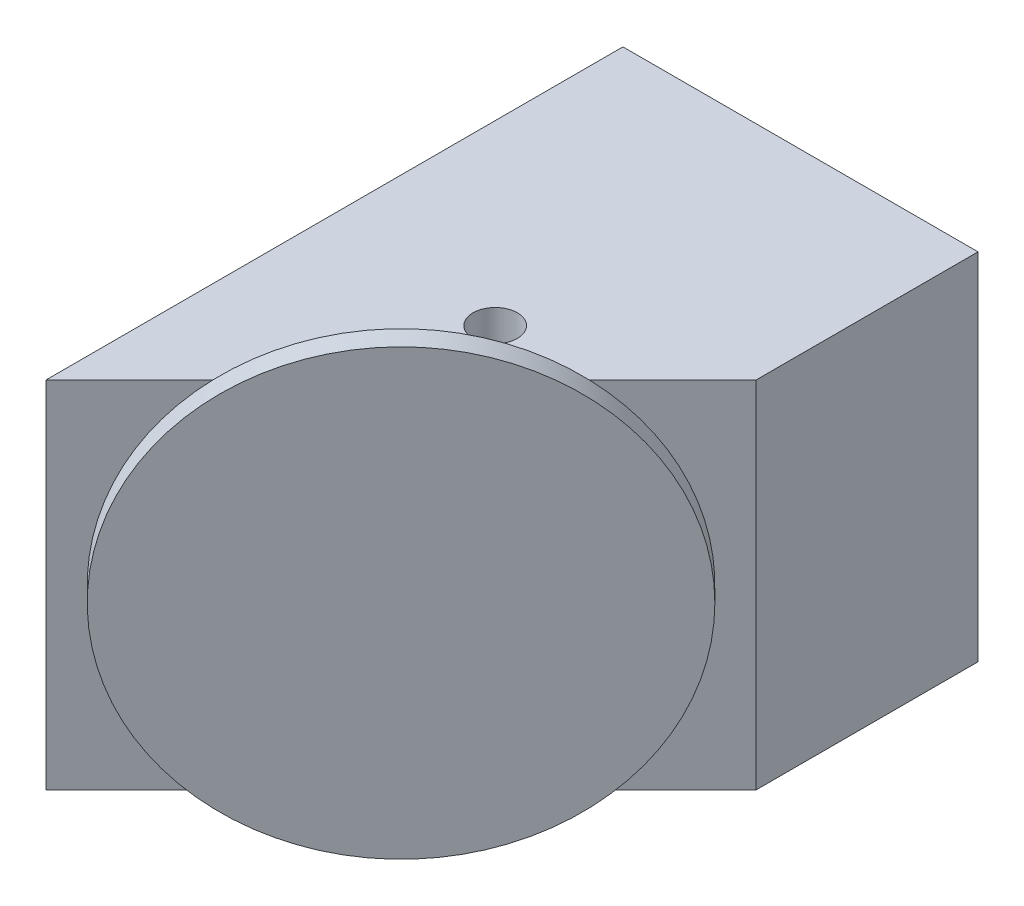
ISO-10303-21;
HEADER;
FILE_DESCRIPTION(('STEP AP214'),'2;1');
FILE_NAME('part.step','',(''),(''),'','','');
FILE_SCHEMA(('AUTOMOTIVE_DESIGN { 1 0 10303 214 1 1 1 1 }'));
ENDSEC;
DATA;
#1=APPLICATION_CONTEXT('core data for automotive mechanical design processes');
#2=APPLICATION_PROTOCOL_DEFINITION('international standard','automotive_design',2000,#1);
#3=PRODUCT_CONTEXT('',#1,'mechanical');
#4=PRODUCT('Part','Part','',(#3));
#5=PRODUCT_RELATED_PRODUCT_CATEGORY('part','',(#4));
#6=PRODUCT_DEFINITION_FORMATION('','',#4);
#7=PRODUCT_DEFINITION_CONTEXT('part definition',#1,'design');
#8=PRODUCT_DEFINITION('design','',#6,#7);
#9=PRODUCT_DEFINITION_SHAPE('','',#8);
#10=(LENGTH_UNIT() NAMED_UNIT(*) SI_UNIT(.MILLI.,.METRE.));
#11=(NAMED_UNIT(*) PLANE_ANGLE_UNIT() SI_UNIT($,.RADIAN.));
#12=(NAMED_UNIT(*) SI_UNIT($,.STERADIAN.) SOLID_ANGLE_UNIT());
#13=UNCERTAINTY_MEASURE_WITH_UNIT(LENGTH_MEASURE(1.E-05),#10,'distance_accuracy_value','');
#14=(GEOMETRIC_REPRESENTATION_CONTEXT(3) GLOBAL_UNCERTAINTY_ASSIGNED_CONTEXT((#13)) GLOBAL_UNIT_ASSIGNED_CONTEXT((#10,
#11,#12)) REPRESENTATION_CONTEXT('',''));
#15=CARTESIAN_POINT('',(0.,0.,0.));
#16=DIRECTION('',(0.,0.,1.));
#17=DIRECTION('',(1.,0.,0.));
#18=AXIS2_PLACEMENT_3D('',#15,#16,#17);
#19=CARTESIAN_POINT('',(0.,16.,26.));
#20=DIRECTION('',(0.707106781186548,0.,0.707106781186548));
#21=DIRECTION('',(0.707106781186548,0.,-0.707106781186548));
#22=AXIS2_PLACEMENT_3D('',#19,#20,#21);
#23=PLANE('',#22);
#24=CARTESIAN_POINT('',(8.00000000000001,8.,18.));
#25=DIRECTION('',(0.707106781186548,0.,0.707106781186547));
#26=DIRECTION('',(0.707106781186547,0.,-0.707106781186548));
#27=AXIS2_PLACEMENT_3D('',#24,#25,#26);
#28=CIRCLE('',#27,10.);
#29=CARTESIAN_POINT('',(3.75735931288072,16.,22.2426406871193));
#30=VERTEX_POINT('',#29);
#31=CARTESIAN_POINT('',(3.75735931288072,0.,22.2426406871193));
#32=VERTEX_POINT('',#31);
#33=EDGE_CURVE('E11',#30,#32,#28,.T.);
#34=ORIENTED_EDGE('',*,*,#33,.F.);
#35=DIRECTION('',(-0.707106781186548,0.,0.707106781186548));
#36=VECTOR('',#35,1.);
#37=CARTESIAN_POINT('',(0.,16.,26.));
#38=LINE('',#37,#36);
#39=CARTESIAN_POINT('',(0.,16.,26.));
#40=VERTEX_POINT('',#39);
#41=EDGE_CURVE('E125',#30,#40,#38,.T.);
#42=ORIENTED_EDGE('',*,*,#41,.T.);
#43=DIRECTION('',(0.,-1.,0.));
#44=VECTOR('',#43,1.);
#45=CARTESIAN_POINT('',(0.,16.,26.));
#46=LINE('',#45,#44);
#47=CARTESIAN_POINT('',(0.,0.,26.));
#48=VERTEX_POINT('',#47);
#49=EDGE_CURVE('E122',#40,#48,#46,.T.);
#50=ORIENTED_EDGE('',*,*,#49,.T.);
#51=DIRECTION('',(-0.707106781186548,0.,0.707106781186548));
#52=VECTOR('',#51,1.);
#53=CARTESIAN_POINT('',(0.,0.,26.));
#54=LINE('',#53,#52);
#55=EDGE_CURVE('E56',#32,#48,#54,.T.);
#56=ORIENTED_EDGE('',*,*,#55,.F.);
#57=EDGE_LOOP('',(#34,#42,#50,#56));
#58=FACE_BOUND('',#57,.T.);
#59=ADVANCED_FACE('F35',(#58),#23,.T.);
#60=CARTESIAN_POINT('',(0.,0.,0.));
#61=DIRECTION('',(0.,0.,-1.));
#62=DIRECTION('',(-1.,0.,0.));
#63=AXIS2_PLACEMENT_3D('',#60,#61,#62);
#64=PLANE('',#63);
#65=DIRECTION('',(0.,-1.,0.));
#66=VECTOR('',#65,1.);
#67=CARTESIAN_POINT('',(0.,0.,0.));
#68=LINE('',#67,#66);
#69=CARTESIAN_POINT('',(0.,16.,0.));
#70=VERTEX_POINT('',#69);
#71=CARTESIAN_POINT('',(0.,0.,0.));
#72=VERTEX_POINT('',#71);
#73=EDGE_CURVE('E182',#70,#72,#68,.T.);
#74=ORIENTED_EDGE('',*,*,#73,.F.);
#75=DIRECTION('',(-1.,0.,0.));
#76=VECTOR('',#75,1.);
#77=CARTESIAN_POINT('',(0.,16.,0.));
#78=LINE('',#77,#76);
#79=CARTESIAN_POINT('',(16.,16.,0.));
#80=VERTEX_POINT('',#79);
#81=EDGE_CURVE('E185',#80,#70,#78,.T.);
#82=ORIENTED_EDGE('',*,*,#81,.F.);
#83=DIRECTION('',(0.,1.,0.));
#84=VECTOR('',#83,1.);
#85=CARTESIAN_POINT('',(16.,0.,0.));
#86=LINE('',#85,#84);
#87=CARTESIAN_POINT('',(16.,0.,0.));
#88=VERTEX_POINT('',#87);
#89=EDGE_CURVE('E190',#88,#80,#86,.T.);
#90=ORIENTED_EDGE('',*,*,#89,.F.);
#91=DIRECTION('',(1.,0.,0.));
#92=VECTOR('',#91,1.);
#93=CARTESIAN_POINT('',(0.,0.,0.));
#94=LINE('',#93,#92);
#95=EDGE_CURVE('E188',#72,#88,#94,.T.);
#96=ORIENTED_EDGE('',*,*,#95,.F.);
#97=EDGE_LOOP('',(#74,#82,#90,#96));
#98=FACE_BOUND('',#97,.T.);
#99=DIRECTION('',(-1.,0.,0.));
#100=VECTOR('',#99,1.);
#101=CARTESIAN_POINT('',(3.,13.,0.));
#102=LINE('',#101,#100);
#103=CARTESIAN_POINT('',(13.,13.,0.));
#104=VERTEX_POINT('',#103);
#105=CARTESIAN_POINT('',(3.,13.,0.));
#106=VERTEX_POINT('',#105);
#107=EDGE_CURVE('E153',#104,#106,#102,.T.);
#108=ORIENTED_EDGE('',*,*,#107,.T.);
#109=DIRECTION('',(0.,-1.,0.));
#110=VECTOR('',#109,1.);
#111=CARTESIAN_POINT('',(3.,3.,0.));
#112=LINE('',#111,#110);
#113=CARTESIAN_POINT('',(3.,3.,0.));
#114=VERTEX_POINT('',#113);
#115=EDGE_CURVE('E148',#106,#114,#112,.T.);
#116=ORIENTED_EDGE('',*,*,#115,.T.);
#117=DIRECTION('',(1.,0.,0.));
#118=VECTOR('',#117,1.);
#119=CARTESIAN_POINT('',(3.,3.,0.));
#120=LINE('',#119,#118);
#121=CARTESIAN_POINT('',(13.,3.,0.));
#122=VERTEX_POINT('',#121);
#123=EDGE_CURVE('E165',#114,#122,#120,.T.);
#124=ORIENTED_EDGE('',*,*,#123,.T.);
#125=DIRECTION('',(0.,1.,0.));
#126=VECTOR('',#125,1.);
#127=CARTESIAN_POINT('',(13.,3.,0.));
#128=LINE('',#127,#126);
#129=EDGE_CURVE('E168',#122,#104,#128,.T.);
#130=ORIENTED_EDGE('',*,*,#129,.T.);
#131=EDGE_LOOP('',(#108,#116,#124,#130));
#132=FACE_BOUND('',#131,.T.);
#133=ADVANCED_FACE('F209',(#98,#132),#64,.T.);
#134=CARTESIAN_POINT('',(0.,0.,10.));
#135=DIRECTION('',(1.,0.,0.));
#136=DIRECTION('',(0.,0.,-1.));
#137=AXIS2_PLACEMENT_3D('',#134,#135,#136);
#138=PLANE('',#137);
#139=ORIENTED_EDGE('',*,*,#73,.T.);
#140=DIRECTION('',(0.,0.,-1.));
#141=VECTOR('',#140,1.);
#142=CARTESIAN_POINT('',(0.,0.,10.));
#143=LINE('',#142,#141);
#144=EDGE_CURVE('E39',#48,#72,#143,.T.);
#145=ORIENTED_EDGE('',*,*,#144,.F.);
#146=ORIENTED_EDGE('',*,*,#49,.F.);
#147=DIRECTION('',(0.,0.,-1.));
#148=VECTOR('',#147,1.);
#149=CARTESIAN_POINT('',(0.,16.,10.));
#150=LINE('',#149,#148);
#151=EDGE_CURVE('E184',#40,#70,#150,.T.);
#152=ORIENTED_EDGE('',*,*,#151,.T.);
#153=EDGE_LOOP('',(#139,#145,#146,#152));
#154=FACE_BOUND('',#153,.T.);
#155=ADVANCED_FACE('F37',(#154),#138,.F.);
#156=CARTESIAN_POINT('',(0.,0.,10.));
#157=DIRECTION('',(0.,1.,0.));
#158=DIRECTION('',(0.,0.,1.));
#159=AXIS2_PLACEMENT_3D('',#156,#157,#158);
#160=PLANE('',#159);
#161=CARTESIAN_POINT('',(8.00000000000001,0.,13.7573593128807));
#162=DIRECTION('',(0.,-1.,0.));
#163=DIRECTION('',(0.,0.,-1.));
#164=AXIS2_PLACEMENT_3D('',#161,#162,#163);
#165=CIRCLE('',#164,1.);
#166=CARTESIAN_POINT('',(8.00000000000001,0.,12.7573593128807));
#167=VERTEX_POINT('',#166);
#168=EDGE_CURVE('E259',#167,#167,#165,.T.);
#169=ORIENTED_EDGE('',*,*,#168,.F.);
#170=EDGE_LOOP('',(#169));
#171=FACE_BOUND('',#170,.T.);
#172=ORIENTED_EDGE('',*,*,#95,.T.);
#173=DIRECTION('',(0.,0.,-1.));
#174=VECTOR('',#173,1.);
#175=CARTESIAN_POINT('',(16.,0.,10.));
#176=LINE('',#175,#174);
#177=CARTESIAN_POINT('',(16.,0.,10.));
#178=VERTEX_POINT('',#177);
#179=EDGE_CURVE('E196',#178,#88,#176,.T.);
#180=ORIENTED_EDGE('',*,*,#179,.F.);
#181=CARTESIAN_POINT('',(12.2426406871193,0.,13.7573593128807));
#182=VERTEX_POINT('',#181);
#183=EDGE_CURVE('E144',#178,#182,#54,.T.);
#184=ORIENTED_EDGE('',*,*,#183,.T.);
#185=EDGE_CURVE('E146',#182,#32,#54,.T.);
#186=ORIENTED_EDGE('',*,*,#185,.T.);
#187=ORIENTED_EDGE('',*,*,#55,.T.);
#188=ORIENTED_EDGE('',*,*,#144,.T.);
#189=EDGE_LOOP('',(#172,#180,#184,#186,#187,#188));
#190=FACE_BOUND('',#189,.T.);
#191=ADVANCED_FACE('F203',(#171,#190),#160,.F.);
#192=CARTESIAN_POINT('',(16.,0.,10.));
#193=DIRECTION('',(-1.,0.,0.));
#194=DIRECTION('',(0.,0.,1.));
#195=AXIS2_PLACEMENT_3D('',#192,#193,#194);
#196=PLANE('',#195);
#197=ORIENTED_EDGE('',*,*,#89,.T.);
#198=DIRECTION('',(0.,0.,-1.));
#199=VECTOR('',#198,1.);
#200=CARTESIAN_POINT('',(16.,16.,10.));
#201=LINE('',#200,#199);
#202=CARTESIAN_POINT('',(16.,16.,10.));
#203=VERTEX_POINT('',#202);
#204=EDGE_CURVE('E195',#203,#80,#201,.T.);
#205=ORIENTED_EDGE('',*,*,#204,.F.);
#206=DIRECTION('',(0.,1.,0.));
#207=VECTOR('',#206,1.);
#208=CARTESIAN_POINT('',(16.,0.,10.));
#209=LINE('',#208,#207);
#210=EDGE_CURVE('E119',#178,#203,#209,.T.);
#211=ORIENTED_EDGE('',*,*,#210,.F.);
#212=ORIENTED_EDGE('',*,*,#179,.T.);
#213=EDGE_LOOP('',(#197,#205,#211,#212));
#214=FACE_BOUND('',#213,.T.);
#215=ADVANCED_FACE('F211',(#214),#196,.F.);
#216=CARTESIAN_POINT('',(0.,16.,10.));
#217=DIRECTION('',(0.,-1.,0.));
#218=DIRECTION('',(0.,0.,-1.));
#219=AXIS2_PLACEMENT_3D('',#216,#217,#218);
#220=PLANE('',#219);
#221=CARTESIAN_POINT('',(8.00000000000001,16.,13.7573593128807));
#222=DIRECTION('',(0.,-1.,0.));
#223=DIRECTION('',(0.,0.,-1.));
#224=AXIS2_PLACEMENT_3D('',#221,#222,#223);
#225=CIRCLE('',#224,1.);
#226=CARTESIAN_POINT('',(8.00000000000001,16.,12.7573593128807));
#227=VERTEX_POINT('',#226);
#228=EDGE_CURVE('E141',#227,#227,#225,.T.);
#229=ORIENTED_EDGE('',*,*,#228,.T.);
#230=EDGE_LOOP('',(#229));
#231=FACE_BOUND('',#230,.T.);
#232=ORIENTED_EDGE('',*,*,#81,.T.);
#233=ORIENTED_EDGE('',*,*,#151,.F.);
#234=ORIENTED_EDGE('',*,*,#41,.F.);
#235=CARTESIAN_POINT('',(12.2426406871193,16.,13.7573593128807));
#236=VERTEX_POINT('',#235);
#237=EDGE_CURVE('E123',#236,#30,#38,.T.);
#238=ORIENTED_EDGE('',*,*,#237,.F.);
#239=EDGE_CURVE('E112',#203,#236,#38,.T.);
#240=ORIENTED_EDGE('',*,*,#239,.F.);
#241=ORIENTED_EDGE('',*,*,#204,.T.);
#242=EDGE_LOOP('',(#232,#233,#234,#238,#240,#241));
#243=FACE_BOUND('',#242,.T.);
#244=ADVANCED_FACE('F127',(#231,#243),#220,.F.);
#245=CARTESIAN_POINT('',(3.,3.,10.));
#246=DIRECTION('',(1.,0.,0.));
#247=DIRECTION('',(0.,0.,-1.));
#248=AXIS2_PLACEMENT_3D('',#245,#246,#247);
#249=PLANE('',#248);
#250=ORIENTED_EDGE('',*,*,#115,.F.);
#251=DIRECTION('',(0.,0.,-1.));
#252=VECTOR('',#251,1.);
#253=CARTESIAN_POINT('',(3.,13.,10.));
#254=LINE('',#253,#252);
#255=CARTESIAN_POINT('',(3.,13.,10.));
#256=VERTEX_POINT('',#255);
#257=EDGE_CURVE('E162',#256,#106,#254,.T.);
#258=ORIENTED_EDGE('',*,*,#257,.F.);
#259=DIRECTION('',(0.,-1.,0.));
#260=VECTOR('',#259,1.);
#261=CARTESIAN_POINT('',(3.,3.,10.));
#262=LINE('',#261,#260);
#263=CARTESIAN_POINT('',(3.,3.,10.));
#264=VERTEX_POINT('',#263);
#265=EDGE_CURVE('E149',#256,#264,#262,.T.);
#266=ORIENTED_EDGE('',*,*,#265,.T.);
#267=DIRECTION('',(0.,0.,-1.));
#268=VECTOR('',#267,1.);
#269=CARTESIAN_POINT('',(3.,3.,10.));
#270=LINE('',#269,#268);
#271=EDGE_CURVE('E179',#264,#114,#270,.T.);
#272=ORIENTED_EDGE('',*,*,#271,.T.);
#273=EDGE_LOOP('',(#250,#258,#266,#272));
#274=FACE_BOUND('',#273,.T.);
#275=ADVANCED_FACE('F243',(#274),#249,.T.);
#276=CARTESIAN_POINT('',(3.,3.,10.));
#277=DIRECTION('',(0.,1.,0.));
#278=DIRECTION('',(0.,0.,1.));
#279=AXIS2_PLACEMENT_3D('',#276,#277,#278);
#280=PLANE('',#279);
#281=ORIENTED_EDGE('',*,*,#123,.F.);
#282=ORIENTED_EDGE('',*,*,#271,.F.);
#283=DIRECTION('',(1.,0.,0.));
#284=VECTOR('',#283,1.);
#285=CARTESIAN_POINT('',(3.,3.,10.));
#286=LINE('',#285,#284);
#287=CARTESIAN_POINT('',(13.,3.,10.));
#288=VERTEX_POINT('',#287);
#289=EDGE_CURVE('E152',#264,#288,#286,.T.);
#290=ORIENTED_EDGE('',*,*,#289,.T.);
#291=DIRECTION('',(0.,0.,-1.));
#292=VECTOR('',#291,1.);
#293=CARTESIAN_POINT('',(13.,3.,10.));
#294=LINE('',#293,#292);
#295=EDGE_CURVE('E177',#288,#122,#294,.T.);
#296=ORIENTED_EDGE('',*,*,#295,.T.);
#297=EDGE_LOOP('',(#281,#282,#290,#296));
#298=FACE_BOUND('',#297,.T.);
#299=ADVANCED_FACE('F239',(#298),#280,.T.);
#300=CARTESIAN_POINT('',(13.,3.,10.));
#301=DIRECTION('',(-1.,0.,0.));
#302=DIRECTION('',(0.,-1.,0.));
#303=AXIS2_PLACEMENT_3D('',#300,#301,#302);
#304=PLANE('',#303);
#305=ORIENTED_EDGE('',*,*,#129,.F.);
#306=ORIENTED_EDGE('',*,*,#295,.F.);
#307=DIRECTION('',(0.,1.,0.));
#308=VECTOR('',#307,1.);
#309=CARTESIAN_POINT('',(13.,3.,10.));
#310=LINE('',#309,#308);
#311=CARTESIAN_POINT('',(13.,13.,10.));
#312=VERTEX_POINT('',#311);
#313=EDGE_CURVE('E156',#288,#312,#310,.T.);
#314=ORIENTED_EDGE('',*,*,#313,.T.);
#315=DIRECTION('',(0.,0.,-1.));
#316=VECTOR('',#315,1.);
#317=CARTESIAN_POINT('',(13.,13.,10.));
#318=LINE('',#317,#316);
#319=EDGE_CURVE('E175',#312,#104,#318,.T.);
#320=ORIENTED_EDGE('',*,*,#319,.T.);
#321=EDGE_LOOP('',(#305,#306,#314,#320));
#322=FACE_BOUND('',#321,.T.);
#323=ADVANCED_FACE('F233',(#322),#304,.T.);
#324=CARTESIAN_POINT('',(3.,13.,10.));
#325=DIRECTION('',(0.,-1.,0.));
#326=DIRECTION('',(0.,0.,-1.));
#327=AXIS2_PLACEMENT_3D('',#324,#325,#326);
#328=PLANE('',#327);
#329=ORIENTED_EDGE('',*,*,#107,.F.);
#330=ORIENTED_EDGE('',*,*,#319,.F.);
#331=DIRECTION('',(-1.,0.,0.));
#332=VECTOR('',#331,1.);
#333=CARTESIAN_POINT('',(3.,13.,10.));
#334=LINE('',#333,#332);
#335=EDGE_CURVE('E159',#312,#256,#334,.T.);
#336=ORIENTED_EDGE('',*,*,#335,.T.);
#337=ORIENTED_EDGE('',*,*,#257,.T.);
#338=EDGE_LOOP('',(#329,#330,#336,#337));
#339=FACE_BOUND('',#338,.T.);
#340=ADVANCED_FACE('F228',(#339),#328,.T.);
#341=CARTESIAN_POINT('',(16.,16.,10.));
#342=DIRECTION('',(0.,0.,-1.));
#343=DIRECTION('',(-1.,0.,0.));
#344=AXIS2_PLACEMENT_3D('',#341,#342,#343);
#345=PLANE('',#344);
#346=ORIENTED_EDGE('',*,*,#265,.F.);
#347=ORIENTED_EDGE('',*,*,#335,.F.);
#348=ORIENTED_EDGE('',*,*,#313,.F.);
#349=ORIENTED_EDGE('',*,*,#289,.F.);
#350=EDGE_LOOP('',(#346,#347,#348,#349));
#351=FACE_BOUND('',#350,.T.);
#352=ADVANCED_FACE('F221',(#351),#345,.T.);
#353=EDGE_CURVE('E44',#182,#236,#28,.T.);
#354=ORIENTED_EDGE('',*,*,#353,.F.);
#355=ORIENTED_EDGE('',*,*,#183,.F.);
#356=ORIENTED_EDGE('',*,*,#210,.T.);
#357=ORIENTED_EDGE('',*,*,#239,.T.);
#358=EDGE_LOOP('',(#354,#355,#356,#357));
#359=FACE_BOUND('',#358,.T.);
#360=ADVANCED_FACE('F114',(#359),#23,.T.);
#361=CARTESIAN_POINT('',(13.,0.,13.));
#362=DIRECTION('',(0.707106781186548,0.,0.707106781186547));
#363=DIRECTION('',(0.707106781186547,0.,-0.707106781186548));
#364=AXIS2_PLACEMENT_3D('',#361,#362,#363);
#365=PLANE('',#364);
#366=EDGE_CURVE('E135',#236,#30,#28,.T.);
#367=ORIENTED_EDGE('',*,*,#366,.F.);
#368=ORIENTED_EDGE('',*,*,#237,.T.);
#369=EDGE_LOOP('',(#367,#368));
#370=FACE_BOUND('',#369,.T.);
#371=ADVANCED_FACE('F137',(#370),#365,.F.);
#372=CARTESIAN_POINT('',(8.70710678118656,8.,18.7071067811866));
#373=DIRECTION('',(-0.707106781186548,0.,-0.707106781186547));
#374=DIRECTION('',(-0.707106781186547,0.,0.707106781186548));
#375=AXIS2_PLACEMENT_3D('',#372,#373,#374);
#376=CYLINDRICAL_SURFACE('',#375,10.);
#377=CARTESIAN_POINT('',(8.70710678118656,8.,18.7071067811866));
#378=DIRECTION('',(0.707106781186548,0.,0.707106781186547));
#379=DIRECTION('',(0.707106781186547,0.,-0.707106781186548));
#380=AXIS2_PLACEMENT_3D('',#377,#378,#379);
#381=CIRCLE('',#380,10.);
#382=CARTESIAN_POINT('',(15.778174593052,8.,11.6360389693211));
#383=VERTEX_POINT('',#382);
#384=EDGE_CURVE('E138',#383,#383,#381,.T.);
#385=ORIENTED_EDGE('',*,*,#384,.F.);
#386=EDGE_LOOP('',(#385));
#387=FACE_BOUND('',#386,.T.);
#388=ORIENTED_EDGE('',*,*,#366,.T.);
#389=ORIENTED_EDGE('',*,*,#33,.T.);
#390=EDGE_CURVE('E46',#32,#182,#28,.T.);
#391=ORIENTED_EDGE('',*,*,#390,.T.);
#392=ORIENTED_EDGE('',*,*,#353,.T.);
#393=EDGE_LOOP('',(#388,#389,#391,#392));
#394=FACE_BOUND('',#393,.T.);
#395=ADVANCED_FACE('F134',(#387,#394),#376,.T.);
#396=CARTESIAN_POINT('',(13.7071067811866,0.,13.7071067811866));
#397=DIRECTION('',(0.707106781186548,0.,0.707106781186547));
#398=DIRECTION('',(0.707106781186547,0.,-0.707106781186548));
#399=AXIS2_PLACEMENT_3D('',#396,#397,#398);
#400=PLANE('',#399);
#401=ORIENTED_EDGE('',*,*,#384,.T.);
#402=EDGE_LOOP('',(#401));
#403=FACE_BOUND('',#402,.T.);
#404=ADVANCED_FACE('F271',(#403),#400,.T.);
#405=ORIENTED_EDGE('',*,*,#185,.F.);
#406=ORIENTED_EDGE('',*,*,#390,.F.);
#407=EDGE_LOOP('',(#405,#406));
#408=FACE_BOUND('',#407,.T.);
#409=ADVANCED_FACE('F227',(#408),#365,.F.);
#410=CARTESIAN_POINT('',(8.00000000000001,16.,13.7573593128807));
#411=DIRECTION('',(0.,-1.,0.));
#412=DIRECTION('',(0.,0.,-1.));
#413=AXIS2_PLACEMENT_3D('',#410,#411,#412);
#414=CYLINDRICAL_SURFACE('',#413,1.);
#415=ORIENTED_EDGE('',*,*,#228,.F.);
#416=EDGE_LOOP('',(#415));
#417=FACE_BOUND('',#416,.T.);
#418=ORIENTED_EDGE('',*,*,#168,.T.);
#419=EDGE_LOOP('',(#418));
#420=FACE_BOUND('',#419,.T.);
#421=ADVANCED_FACE('F265',(#417,#420),#414,.F.);
#422=CLOSED_SHELL('',(#59,#133,#155,#191,#215,#244,#275,#299,#323,#340,#352,#360,#371,#395,#404,
#409,#421));
#423=MANIFOLD_SOLID_BREP('B2',#422);
#424=ADVANCED_BREP_SHAPE_REPRESENTATION('',(#18,#423),#14);
#425=SHAPE_DEFINITION_REPRESENTATION(#9,#424);
ENDSEC;
END-ISO-10303-21;
